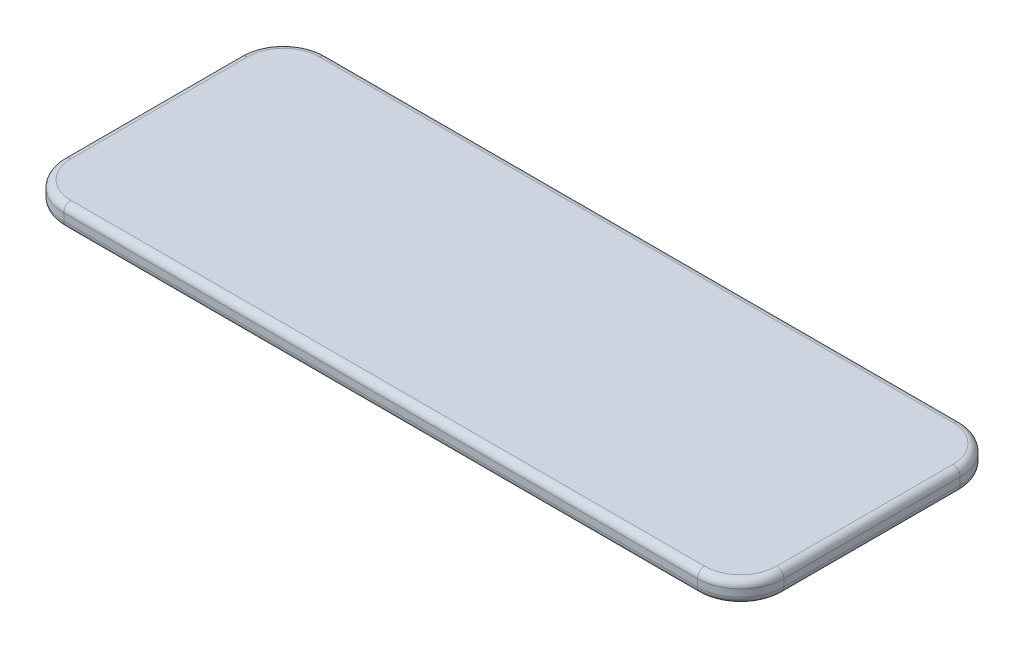
ISO-10303-21;
HEADER;
FILE_DESCRIPTION(('STEP AP214'),'2;1');
FILE_NAME('part.step','',(''),(''),'','','');
FILE_SCHEMA(('AUTOMOTIVE_DESIGN { 1 0 10303 214 1 1 1 1 }'));
ENDSEC;
DATA;
#1=APPLICATION_CONTEXT('core data for automotive mechanical design processes');
#2=APPLICATION_PROTOCOL_DEFINITION('international standard','automotive_design',2000,#1);
#3=PRODUCT_CONTEXT('',#1,'mechanical');
#4=PRODUCT('Part','Part','',(#3));
#5=PRODUCT_RELATED_PRODUCT_CATEGORY('part','',(#4));
#6=PRODUCT_DEFINITION_FORMATION('','',#4);
#7=PRODUCT_DEFINITION_CONTEXT('part definition',#1,'design');
#8=PRODUCT_DEFINITION('design','',#6,#7);
#9=PRODUCT_DEFINITION_SHAPE('','',#8);
#10=(LENGTH_UNIT() NAMED_UNIT(*) SI_UNIT(.MILLI.,.METRE.));
#11=(NAMED_UNIT(*) PLANE_ANGLE_UNIT() SI_UNIT($,.RADIAN.));
#12=(NAMED_UNIT(*) SI_UNIT($,.STERADIAN.) SOLID_ANGLE_UNIT());
#13=UNCERTAINTY_MEASURE_WITH_UNIT(LENGTH_MEASURE(1.E-05),#10,'distance_accuracy_value','');
#14=(GEOMETRIC_REPRESENTATION_CONTEXT(3) GLOBAL_UNCERTAINTY_ASSIGNED_CONTEXT((#13)) GLOBAL_UNIT_ASSIGNED_CONTEXT((#10,
#11,#12)) REPRESENTATION_CONTEXT('',''));
#15=CARTESIAN_POINT('',(0.,0.,0.));
#16=DIRECTION('',(0.,0.,1.));
#17=DIRECTION('',(1.,0.,0.));
#18=AXIS2_PLACEMENT_3D('',#15,#16,#17);
#19=CARTESIAN_POINT('',(-60.,30.,-305.));
#20=DIRECTION('',(0.,-1.,0.));
#21=DIRECTION('',(0.,0.,-1.));
#22=AXIS2_PLACEMENT_3D('',#19,#20,#21);
#23=CYLINDRICAL_SURFACE('',#22,60.);
#24=DIRECTION('',(0.,-1.,0.));
#25=VECTOR('',#24,1.);
#26=CARTESIAN_POINT('',(0.,30.,-305.));
#27=LINE('',#26,#25);
#28=CARTESIAN_POINT('',(0.,20.,-305.));
#29=VERTEX_POINT('',#28);
#30=CARTESIAN_POINT('',(0.,10.,-305.));
#31=VERTEX_POINT('',#30);
#32=EDGE_CURVE('E250',#29,#31,#27,.T.);
#33=ORIENTED_EDGE('',*,*,#32,.T.);
#34=CARTESIAN_POINT('',(-60.,10.,-305.));
#35=DIRECTION('',(0.,1.,0.));
#36=DIRECTION('',(0.,0.,1.));
#37=AXIS2_PLACEMENT_3D('',#34,#35,#36);
#38=CIRCLE('',#37,60.);
#39=CARTESIAN_POINT('',(-60.0000000000004,10.,-365.));
#40=VERTEX_POINT('',#39);
#41=EDGE_CURVE('E308',#31,#40,#38,.T.);
#42=ORIENTED_EDGE('',*,*,#41,.T.);
#43=DIRECTION('',(0.,-1.,0.));
#44=VECTOR('',#43,1.);
#45=CARTESIAN_POINT('',(-60.0000000000004,30.,-365.));
#46=LINE('',#45,#44);
#47=CARTESIAN_POINT('',(-60.0000000000004,20.,-365.));
#48=VERTEX_POINT('',#47);
#49=EDGE_CURVE('E184',#48,#40,#46,.T.);
#50=ORIENTED_EDGE('',*,*,#49,.F.);
#51=CARTESIAN_POINT('',(-60.,20.,-305.));
#52=DIRECTION('',(0.,1.,0.));
#53=DIRECTION('',(0.,0.,1.));
#54=AXIS2_PLACEMENT_3D('',#51,#52,#53);
#55=CIRCLE('',#54,60.);
#56=EDGE_CURVE('E311',#48,#29,#55,.F.);
#57=ORIENTED_EDGE('',*,*,#56,.T.);
#58=EDGE_LOOP('',(#33,#42,#50,#57));
#59=FACE_BOUND('',#58,.T.);
#60=ADVANCED_FACE('F41',(#59),#23,.T.);
#61=CARTESIAN_POINT('',(-60.0000000000004,30.,-365.));
#62=DIRECTION('',(0.,0.,1.));
#63=DIRECTION('',(1.,0.,0.));
#64=AXIS2_PLACEMENT_3D('',#61,#62,#63);
#65=PLANE('',#64);
#66=ORIENTED_EDGE('',*,*,#49,.T.);
#67=DIRECTION('',(-1.,0.,0.));
#68=VECTOR('',#67,1.);
#69=CARTESIAN_POINT('',(-60.0000000000004,10.,-365.));
#70=LINE('',#69,#68);
#71=CARTESIAN_POINT('',(-940.,10.,-365.));
#72=VERTEX_POINT('',#71);
#73=EDGE_CURVE('E314',#40,#72,#70,.T.);
#74=ORIENTED_EDGE('',*,*,#73,.T.);
#75=DIRECTION('',(0.,-1.,0.));
#76=VECTOR('',#75,1.);
#77=CARTESIAN_POINT('',(-940.,30.,-365.));
#78=LINE('',#77,#76);
#79=CARTESIAN_POINT('',(-940.,20.,-365.));
#80=VERTEX_POINT('',#79);
#81=EDGE_CURVE('E175',#80,#72,#78,.T.);
#82=ORIENTED_EDGE('',*,*,#81,.F.);
#83=DIRECTION('',(-1.,0.,0.));
#84=VECTOR('',#83,1.);
#85=CARTESIAN_POINT('',(-60.0000000000004,20.,-365.));
#86=LINE('',#85,#84);
#87=EDGE_CURVE('E317',#80,#48,#86,.F.);
#88=ORIENTED_EDGE('',*,*,#87,.T.);
#89=EDGE_LOOP('',(#66,#74,#82,#88));
#90=FACE_BOUND('',#89,.T.);
#91=ADVANCED_FACE('F389',(#90),#65,.F.);
#92=CARTESIAN_POINT('',(-940.,30.,-305.));
#93=DIRECTION('',(0.,-1.,0.));
#94=DIRECTION('',(0.,0.,-1.));
#95=AXIS2_PLACEMENT_3D('',#92,#93,#94);
#96=CYLINDRICAL_SURFACE('',#95,60.);
#97=ORIENTED_EDGE('',*,*,#81,.T.);
#98=CARTESIAN_POINT('',(-940.,10.,-305.));
#99=DIRECTION('',(0.,1.,0.));
#100=DIRECTION('',(0.,0.,1.));
#101=AXIS2_PLACEMENT_3D('',#98,#99,#100);
#102=CIRCLE('',#101,60.);
#103=CARTESIAN_POINT('',(-1000.,10.,-304.999999999999));
#104=VERTEX_POINT('',#103);
#105=EDGE_CURVE('E173',#72,#104,#102,.T.);
#106=ORIENTED_EDGE('',*,*,#105,.T.);
#107=DIRECTION('',(0.,-1.,0.));
#108=VECTOR('',#107,1.);
#109=CARTESIAN_POINT('',(-1000.,30.,-304.999999999999));
#110=LINE('',#109,#108);
#111=CARTESIAN_POINT('',(-1000.,20.,-304.999999999999));
#112=VERTEX_POINT('',#111);
#113=EDGE_CURVE('E159',#112,#104,#110,.T.);
#114=ORIENTED_EDGE('',*,*,#113,.F.);
#115=CARTESIAN_POINT('',(-940.,20.,-305.));
#116=DIRECTION('',(0.,1.,0.));
#117=DIRECTION('',(0.,0.,1.));
#118=AXIS2_PLACEMENT_3D('',#115,#116,#117);
#119=CIRCLE('',#118,60.);
#120=EDGE_CURVE('E170',#112,#80,#119,.F.);
#121=ORIENTED_EDGE('',*,*,#120,.T.);
#122=EDGE_LOOP('',(#97,#106,#114,#121));
#123=FACE_BOUND('',#122,.T.);
#124=ADVANCED_FACE('F169',(#123),#96,.T.);
#125=CARTESIAN_POINT('',(-1000.,30.,-60.0000000000004));
#126=DIRECTION('',(1.,0.,0.));
#127=DIRECTION('',(0.,0.,-1.));
#128=AXIS2_PLACEMENT_3D('',#125,#126,#127);
#129=PLANE('',#128);
#130=DIRECTION('',(0.,-1.,0.));
#131=VECTOR('',#130,1.);
#132=CARTESIAN_POINT('',(-1000.,30.,-60.0000000000004));
#133=LINE('',#132,#131);
#134=CARTESIAN_POINT('',(-1000.,20.,-60.0000000000004));
#135=VERTEX_POINT('',#134);
#136=CARTESIAN_POINT('',(-1000.,10.,-60.0000000000004));
#137=VERTEX_POINT('',#136);
#138=EDGE_CURVE('E161',#135,#137,#133,.T.);
#139=ORIENTED_EDGE('',*,*,#138,.F.);
#140=DIRECTION('',(0.,0.,1.));
#141=VECTOR('',#140,1.);
#142=CARTESIAN_POINT('',(-1000.,20.,-304.999999999999));
#143=LINE('',#142,#141);
#144=EDGE_CURVE('E11',#135,#112,#143,.F.);
#145=ORIENTED_EDGE('',*,*,#144,.T.);
#146=ORIENTED_EDGE('',*,*,#113,.T.);
#147=DIRECTION('',(0.,0.,1.));
#148=VECTOR('',#147,1.);
#149=CARTESIAN_POINT('',(-1000.,10.,-60.0000000000004));
#150=LINE('',#149,#148);
#151=EDGE_CURVE('E51',#104,#137,#150,.T.);
#152=ORIENTED_EDGE('',*,*,#151,.T.);
#153=EDGE_LOOP('',(#139,#145,#146,#152));
#154=FACE_BOUND('',#153,.T.);
#155=ADVANCED_FACE('F158',(#154),#129,.F.);
#156=CARTESIAN_POINT('',(-940.,30.,-60.));
#157=DIRECTION('',(0.,-1.,0.));
#158=DIRECTION('',(0.,0.,-1.));
#159=AXIS2_PLACEMENT_3D('',#156,#157,#158);
#160=CYLINDRICAL_SURFACE('',#159,60.);
#161=ORIENTED_EDGE('',*,*,#138,.T.);
#162=CARTESIAN_POINT('',(-940.,10.,-60.));
#163=DIRECTION('',(0.,1.,0.));
#164=DIRECTION('',(0.,0.,1.));
#165=AXIS2_PLACEMENT_3D('',#162,#163,#164);
#166=CIRCLE('',#165,60.);
#167=CARTESIAN_POINT('',(-940.,10.,0.));
#168=VERTEX_POINT('',#167);
#169=EDGE_CURVE('E285',#137,#168,#166,.T.);
#170=ORIENTED_EDGE('',*,*,#169,.T.);
#171=DIRECTION('',(0.,-1.,0.));
#172=VECTOR('',#171,1.);
#173=CARTESIAN_POINT('',(-940.,30.,0.));
#174=LINE('',#173,#172);
#175=CARTESIAN_POINT('',(-940.,20.,0.));
#176=VERTEX_POINT('',#175);
#177=EDGE_CURVE('E354',#176,#168,#174,.T.);
#178=ORIENTED_EDGE('',*,*,#177,.F.);
#179=CARTESIAN_POINT('',(-940.,20.,-60.));
#180=DIRECTION('',(0.,1.,0.));
#181=DIRECTION('',(0.,0.,1.));
#182=AXIS2_PLACEMENT_3D('',#179,#180,#181);
#183=CIRCLE('',#182,60.);
#184=EDGE_CURVE('E258',#176,#135,#183,.F.);
#185=ORIENTED_EDGE('',*,*,#184,.T.);
#186=EDGE_LOOP('',(#161,#170,#178,#185));
#187=FACE_BOUND('',#186,.T.);
#188=ADVANCED_FACE('F421',(#187),#160,.T.);
#189=CARTESIAN_POINT('',(-60.0000000000004,30.,0.));
#190=DIRECTION('',(0.,0.,-1.));
#191=DIRECTION('',(-1.,0.,0.));
#192=AXIS2_PLACEMENT_3D('',#189,#190,#191);
#193=PLANE('',#192);
#194=ORIENTED_EDGE('',*,*,#177,.T.);
#195=DIRECTION('',(1.,0.,0.));
#196=VECTOR('',#195,1.);
#197=CARTESIAN_POINT('',(-60.0000000000004,10.,0.));
#198=LINE('',#197,#196);
#199=CARTESIAN_POINT('',(-60.0000000000004,10.,0.));
#200=VERTEX_POINT('',#199);
#201=EDGE_CURVE('E290',#168,#200,#198,.T.);
#202=ORIENTED_EDGE('',*,*,#201,.T.);
#203=DIRECTION('',(0.,-1.,0.));
#204=VECTOR('',#203,1.);
#205=CARTESIAN_POINT('',(-60.0000000000004,30.,0.));
#206=LINE('',#205,#204);
#207=CARTESIAN_POINT('',(-60.0000000000004,20.,0.));
#208=VERTEX_POINT('',#207);
#209=EDGE_CURVE('E358',#208,#200,#206,.T.);
#210=ORIENTED_EDGE('',*,*,#209,.F.);
#211=DIRECTION('',(1.,0.,0.));
#212=VECTOR('',#211,1.);
#213=CARTESIAN_POINT('',(-940.,20.,0.));
#214=LINE('',#213,#212);
#215=EDGE_CURVE('E293',#208,#176,#214,.F.);
#216=ORIENTED_EDGE('',*,*,#215,.T.);
#217=EDGE_LOOP('',(#194,#202,#210,#216));
#218=FACE_BOUND('',#217,.T.);
#219=ADVANCED_FACE('F587',(#218),#193,.F.);
#220=CARTESIAN_POINT('',(-60.,30.,-60.));
#221=DIRECTION('',(0.,-1.,0.));
#222=DIRECTION('',(0.,0.,-1.));
#223=AXIS2_PLACEMENT_3D('',#220,#221,#222);
#224=CYLINDRICAL_SURFACE('',#223,60.);
#225=ORIENTED_EDGE('',*,*,#209,.T.);
#226=CARTESIAN_POINT('',(-60.,10.,-60.));
#227=DIRECTION('',(0.,1.,0.));
#228=DIRECTION('',(0.,0.,1.));
#229=AXIS2_PLACEMENT_3D('',#226,#227,#228);
#230=CIRCLE('',#229,60.);
#231=CARTESIAN_POINT('',(0.,10.,-60.0000000000004));
#232=VERTEX_POINT('',#231);
#233=EDGE_CURVE('E296',#200,#232,#230,.T.);
#234=ORIENTED_EDGE('',*,*,#233,.T.);
#235=DIRECTION('',(0.,-1.,0.));
#236=VECTOR('',#235,1.);
#237=CARTESIAN_POINT('',(0.,30.,-60.0000000000004));
#238=LINE('',#237,#236);
#239=CARTESIAN_POINT('',(0.,20.,-60.0000000000004));
#240=VERTEX_POINT('',#239);
#241=EDGE_CURVE('E362',#240,#232,#238,.T.);
#242=ORIENTED_EDGE('',*,*,#241,.F.);
#243=CARTESIAN_POINT('',(-60.,20.,-60.));
#244=DIRECTION('',(0.,1.,0.));
#245=DIRECTION('',(0.,0.,1.));
#246=AXIS2_PLACEMENT_3D('',#243,#244,#245);
#247=CIRCLE('',#246,60.);
#248=EDGE_CURVE('E299',#240,#208,#247,.F.);
#249=ORIENTED_EDGE('',*,*,#248,.T.);
#250=EDGE_LOOP('',(#225,#234,#242,#249));
#251=FACE_BOUND('',#250,.T.);
#252=ADVANCED_FACE('F399',(#251),#224,.T.);
#253=CARTESIAN_POINT('',(0.,30.,-60.0000000000004));
#254=DIRECTION('',(-1.,0.,0.));
#255=DIRECTION('',(0.,0.,1.));
#256=AXIS2_PLACEMENT_3D('',#253,#254,#255);
#257=PLANE('',#256);
#258=ORIENTED_EDGE('',*,*,#241,.T.);
#259=DIRECTION('',(0.,0.,-1.));
#260=VECTOR('',#259,1.);
#261=CARTESIAN_POINT('',(0.,10.,-60.0000000000004));
#262=LINE('',#261,#260);
#263=EDGE_CURVE('E302',#232,#31,#262,.T.);
#264=ORIENTED_EDGE('',*,*,#263,.T.);
#265=ORIENTED_EDGE('',*,*,#32,.F.);
#266=DIRECTION('',(0.,0.,-1.));
#267=VECTOR('',#266,1.);
#268=CARTESIAN_POINT('',(0.,20.,-60.0000000000004));
#269=LINE('',#268,#267);
#270=EDGE_CURVE('E305',#29,#240,#269,.F.);
#271=ORIENTED_EDGE('',*,*,#270,.T.);
#272=EDGE_LOOP('',(#258,#264,#265,#271));
#273=FACE_BOUND('',#272,.T.);
#274=ADVANCED_FACE('F396',(#273),#257,.F.);
#275=CARTESIAN_POINT('',(-60.,30.,-305.));
#276=DIRECTION('',(0.,1.,0.));
#277=DIRECTION('',(0.,0.,1.));
#278=AXIS2_PLACEMENT_3D('',#275,#276,#277);
#279=PLANE('',#278);
#280=DIRECTION('',(0.,0.,1.));
#281=VECTOR('',#280,1.);
#282=CARTESIAN_POINT('',(-990.,30.,-60.0000000000004));
#283=LINE('',#282,#281);
#284=CARTESIAN_POINT('',(-990.,30.,-304.999999999999));
#285=VERTEX_POINT('',#284);
#286=CARTESIAN_POINT('',(-990.,30.,-60.0000000000003));
#287=VERTEX_POINT('',#286);
#288=EDGE_CURVE('E59',#285,#287,#283,.T.);
#289=ORIENTED_EDGE('',*,*,#288,.T.);
#290=CARTESIAN_POINT('',(-940.,30.,-60.));
#291=DIRECTION('',(0.,1.,0.));
#292=DIRECTION('',(0.,0.,1.));
#293=AXIS2_PLACEMENT_3D('',#290,#291,#292);
#294=CIRCLE('',#293,50.);
#295=CARTESIAN_POINT('',(-940.,30.,-10.));
#296=VERTEX_POINT('',#295);
#297=EDGE_CURVE('E260',#287,#296,#294,.T.);
#298=ORIENTED_EDGE('',*,*,#297,.T.);
#299=DIRECTION('',(1.,0.,0.));
#300=VECTOR('',#299,1.);
#301=CARTESIAN_POINT('',(-60.0000000000004,30.,-10.));
#302=LINE('',#301,#300);
#303=CARTESIAN_POINT('',(-60.0000000000003,30.,-10.));
#304=VERTEX_POINT('',#303);
#305=EDGE_CURVE('E282',#296,#304,#302,.T.);
#306=ORIENTED_EDGE('',*,*,#305,.T.);
#307=CARTESIAN_POINT('',(-60.,30.,-60.));
#308=DIRECTION('',(0.,1.,0.));
#309=DIRECTION('',(0.,0.,1.));
#310=AXIS2_PLACEMENT_3D('',#307,#308,#309);
#311=CIRCLE('',#310,50.);
#312=CARTESIAN_POINT('',(-10.,30.,-60.0000000000004));
#313=VERTEX_POINT('',#312);
#314=EDGE_CURVE('E279',#304,#313,#311,.T.);
#315=ORIENTED_EDGE('',*,*,#314,.T.);
#316=DIRECTION('',(0.,0.,-1.));
#317=VECTOR('',#316,1.);
#318=CARTESIAN_POINT('',(-10.,30.,-305.));
#319=LINE('',#318,#317);
#320=CARTESIAN_POINT('',(-10.,30.,-305.));
#321=VERTEX_POINT('',#320);
#322=EDGE_CURVE('E276',#313,#321,#319,.T.);
#323=ORIENTED_EDGE('',*,*,#322,.T.);
#324=CARTESIAN_POINT('',(-60.,30.,-305.));
#325=DIRECTION('',(0.,1.,0.));
#326=DIRECTION('',(0.,0.,1.));
#327=AXIS2_PLACEMENT_3D('',#324,#325,#326);
#328=CIRCLE('',#327,50.);
#329=CARTESIAN_POINT('',(-60.0000000000004,30.,-355.));
#330=VERTEX_POINT('',#329);
#331=EDGE_CURVE('E273',#321,#330,#328,.T.);
#332=ORIENTED_EDGE('',*,*,#331,.T.);
#333=DIRECTION('',(-1.,0.,0.));
#334=VECTOR('',#333,1.);
#335=CARTESIAN_POINT('',(-940.,30.,-355.));
#336=LINE('',#335,#334);
#337=CARTESIAN_POINT('',(-940.,30.,-355.));
#338=VERTEX_POINT('',#337);
#339=EDGE_CURVE('E270',#330,#338,#336,.T.);
#340=ORIENTED_EDGE('',*,*,#339,.T.);
#341=CARTESIAN_POINT('',(-940.,30.,-305.));
#342=DIRECTION('',(0.,1.,0.));
#343=DIRECTION('',(0.,0.,1.));
#344=AXIS2_PLACEMENT_3D('',#341,#342,#343);
#345=CIRCLE('',#344,50.);
#346=EDGE_CURVE('E64',#338,#285,#345,.T.);
#347=ORIENTED_EDGE('',*,*,#346,.T.);
#348=EDGE_LOOP('',(#289,#298,#306,#315,#323,#332,#340,#347));
#349=FACE_BOUND('',#348,.T.);
#350=ADVANCED_FACE('F565',(#349),#279,.T.);
#351=CARTESIAN_POINT('',(-60.,0.,-305.));
#352=DIRECTION('',(0.,1.,0.));
#353=DIRECTION('',(0.,0.,1.));
#354=AXIS2_PLACEMENT_3D('',#351,#352,#353);
#355=PLANE('',#354);
#356=DIRECTION('',(0.,0.,1.));
#357=VECTOR('',#356,1.);
#358=CARTESIAN_POINT('',(-990.,0.,-305.));
#359=LINE('',#358,#357);
#360=CARTESIAN_POINT('',(-990.,0.,-60.0000000000003));
#361=VERTEX_POINT('',#360);
#362=CARTESIAN_POINT('',(-990.,0.,-304.999999999999));
#363=VERTEX_POINT('',#362);
#364=EDGE_CURVE('E342',#361,#363,#359,.F.);
#365=ORIENTED_EDGE('',*,*,#364,.T.);
#366=CARTESIAN_POINT('',(-940.,0.,-305.));
#367=DIRECTION('',(0.,1.,0.));
#368=DIRECTION('',(0.,0.,1.));
#369=AXIS2_PLACEMENT_3D('',#366,#367,#368);
#370=CIRCLE('',#369,50.);
#371=CARTESIAN_POINT('',(-940.,0.,-355.));
#372=VERTEX_POINT('',#371);
#373=EDGE_CURVE('E320',#363,#372,#370,.F.);
#374=ORIENTED_EDGE('',*,*,#373,.T.);
#375=DIRECTION('',(-1.,0.,0.));
#376=VECTOR('',#375,1.);
#377=CARTESIAN_POINT('',(-60.,0.,-355.));
#378=LINE('',#377,#376);
#379=CARTESIAN_POINT('',(-60.0000000000004,0.,-355.));
#380=VERTEX_POINT('',#379);
#381=EDGE_CURVE('E324',#372,#380,#378,.F.);
#382=ORIENTED_EDGE('',*,*,#381,.T.);
#383=CARTESIAN_POINT('',(-60.,0.,-305.));
#384=DIRECTION('',(0.,1.,0.));
#385=DIRECTION('',(0.,0.,1.));
#386=AXIS2_PLACEMENT_3D('',#383,#384,#385);
#387=CIRCLE('',#386,50.);
#388=CARTESIAN_POINT('',(-10.,0.,-305.));
#389=VERTEX_POINT('',#388);
#390=EDGE_CURVE('E327',#380,#389,#387,.F.);
#391=ORIENTED_EDGE('',*,*,#390,.T.);
#392=DIRECTION('',(0.,0.,-1.));
#393=VECTOR('',#392,1.);
#394=CARTESIAN_POINT('',(-10.,0.,-305.));
#395=LINE('',#394,#393);
#396=CARTESIAN_POINT('',(-10.,0.,-60.0000000000004));
#397=VERTEX_POINT('',#396);
#398=EDGE_CURVE('E330',#389,#397,#395,.F.);
#399=ORIENTED_EDGE('',*,*,#398,.T.);
#400=CARTESIAN_POINT('',(-60.,0.,-60.));
#401=DIRECTION('',(0.,1.,0.));
#402=DIRECTION('',(0.,0.,1.));
#403=AXIS2_PLACEMENT_3D('',#400,#401,#402);
#404=CIRCLE('',#403,50.);
#405=CARTESIAN_POINT('',(-60.0000000000003,0.,-10.));
#406=VERTEX_POINT('',#405);
#407=EDGE_CURVE('E333',#397,#406,#404,.F.);
#408=ORIENTED_EDGE('',*,*,#407,.T.);
#409=DIRECTION('',(1.,0.,0.));
#410=VECTOR('',#409,1.);
#411=CARTESIAN_POINT('',(-60.,0.,-10.));
#412=LINE('',#411,#410);
#413=CARTESIAN_POINT('',(-940.,0.,-9.99999999999997));
#414=VERTEX_POINT('',#413);
#415=EDGE_CURVE('E336',#406,#414,#412,.F.);
#416=ORIENTED_EDGE('',*,*,#415,.T.);
#417=CARTESIAN_POINT('',(-940.,0.,-60.));
#418=DIRECTION('',(0.,1.,0.));
#419=DIRECTION('',(0.,0.,1.));
#420=AXIS2_PLACEMENT_3D('',#417,#418,#419);
#421=CIRCLE('',#420,50.);
#422=EDGE_CURVE('E339',#414,#361,#421,.F.);
#423=ORIENTED_EDGE('',*,*,#422,.T.);
#424=EDGE_LOOP('',(#365,#374,#382,#391,#399,#408,#416,#423));
#425=FACE_BOUND('',#424,.T.);
#426=ADVANCED_FACE('F413',(#425),#355,.F.);
#427=CARTESIAN_POINT('',(-60.,10.,-60.));
#428=DIRECTION('',(0.,1.,0.));
#429=DIRECTION('',(0.,0.,1.));
#430=AXIS2_PLACEMENT_3D('',#427,#428,#429);
#431=TOROIDAL_SURFACE('',#430,50.,10.);
#432=CARTESIAN_POINT('',(-60.0000000000003,10.,-10.));
#433=DIRECTION('',(-1.,0.,0.));
#434=DIRECTION('',(0.,0.,1.));
#435=AXIS2_PLACEMENT_3D('',#432,#433,#434);
#436=CIRCLE('',#435,10.);
#437=EDGE_CURVE('E242',#406,#200,#436,.T.);
#438=ORIENTED_EDGE('',*,*,#437,.F.);
#439=ORIENTED_EDGE('',*,*,#407,.F.);
#440=CARTESIAN_POINT('',(-10.,10.,-60.0000000000003));
#441=DIRECTION('',(0.,0.,-1.));
#442=DIRECTION('',(-1.,0.,0.));
#443=AXIS2_PLACEMENT_3D('',#440,#441,#442);
#444=CIRCLE('',#443,10.);
#445=EDGE_CURVE('E246',#232,#397,#444,.T.);
#446=ORIENTED_EDGE('',*,*,#445,.F.);
#447=ORIENTED_EDGE('',*,*,#233,.F.);
#448=EDGE_LOOP('',(#438,#439,#446,#447));
#449=FACE_BOUND('',#448,.T.);
#450=ADVANCED_FACE('F404',(#449),#431,.T.);
#451=CARTESIAN_POINT('',(-10.,10.,-60.0000000000004));
#452=DIRECTION('',(0.,0.,-1.));
#453=DIRECTION('',(-1.,0.,0.));
#454=AXIS2_PLACEMENT_3D('',#451,#452,#453);
#455=CYLINDRICAL_SURFACE('',#454,10.);
#456=ORIENTED_EDGE('',*,*,#445,.T.);
#457=ORIENTED_EDGE('',*,*,#398,.F.);
#458=CARTESIAN_POINT('',(-10.,10.,-305.));
#459=DIRECTION('',(0.,0.,-1.));
#460=DIRECTION('',(0.,1.,0.));
#461=AXIS2_PLACEMENT_3D('',#458,#459,#460);
#462=CIRCLE('',#461,10.);
#463=EDGE_CURVE('E238',#31,#389,#462,.T.);
#464=ORIENTED_EDGE('',*,*,#463,.F.);
#465=ORIENTED_EDGE('',*,*,#263,.F.);
#466=EDGE_LOOP('',(#456,#457,#464,#465));
#467=FACE_BOUND('',#466,.T.);
#468=ADVANCED_FACE('F378',(#467),#455,.T.);
#469=CARTESIAN_POINT('',(-60.0000000000004,10.,-10.));
#470=DIRECTION('',(1.,0.,0.));
#471=DIRECTION('',(0.,0.,-1.));
#472=AXIS2_PLACEMENT_3D('',#469,#470,#471);
#473=CYLINDRICAL_SURFACE('',#472,10.);
#474=ORIENTED_EDGE('',*,*,#437,.T.);
#475=ORIENTED_EDGE('',*,*,#201,.F.);
#476=CARTESIAN_POINT('',(-940.,10.,-10.));
#477=DIRECTION('',(-1.,0.,0.));
#478=DIRECTION('',(0.,0.,1.));
#479=AXIS2_PLACEMENT_3D('',#476,#477,#478);
#480=CIRCLE('',#479,10.);
#481=EDGE_CURVE('E234',#414,#168,#480,.T.);
#482=ORIENTED_EDGE('',*,*,#481,.F.);
#483=ORIENTED_EDGE('',*,*,#415,.F.);
#484=EDGE_LOOP('',(#474,#475,#482,#483));
#485=FACE_BOUND('',#484,.T.);
#486=ADVANCED_FACE('F409',(#485),#473,.T.);
#487=CARTESIAN_POINT('',(-60.,10.,-305.));
#488=DIRECTION('',(0.,1.,0.));
#489=DIRECTION('',(0.,0.,1.));
#490=AXIS2_PLACEMENT_3D('',#487,#488,#489);
#491=TOROIDAL_SURFACE('',#490,50.,10.);
#492=ORIENTED_EDGE('',*,*,#463,.T.);
#493=ORIENTED_EDGE('',*,*,#390,.F.);
#494=CARTESIAN_POINT('',(-60.0000000000003,10.,-355.));
#495=DIRECTION('',(-1.,0.,0.));
#496=DIRECTION('',(0.,-1.,0.));
#497=AXIS2_PLACEMENT_3D('',#494,#495,#496);
#498=CIRCLE('',#497,10.);
#499=EDGE_CURVE('E230',#40,#380,#498,.T.);
#500=ORIENTED_EDGE('',*,*,#499,.F.);
#501=ORIENTED_EDGE('',*,*,#41,.F.);
#502=EDGE_LOOP('',(#492,#493,#500,#501));
#503=FACE_BOUND('',#502,.T.);
#504=ADVANCED_FACE('F382',(#503),#491,.T.);
#505=CARTESIAN_POINT('',(-940.,10.,-60.));
#506=DIRECTION('',(0.,1.,0.));
#507=DIRECTION('',(0.,0.,1.));
#508=AXIS2_PLACEMENT_3D('',#505,#506,#507);
#509=TOROIDAL_SURFACE('',#508,50.,10.);
#510=ORIENTED_EDGE('',*,*,#481,.T.);
#511=ORIENTED_EDGE('',*,*,#169,.F.);
#512=CARTESIAN_POINT('',(-990.,10.,-60.0000000000003));
#513=DIRECTION('',(0.,0.,-1.));
#514=DIRECTION('',(-1.,0.,0.));
#515=AXIS2_PLACEMENT_3D('',#512,#513,#514);
#516=CIRCLE('',#515,10.);
#517=EDGE_CURVE('E223',#361,#137,#516,.T.);
#518=ORIENTED_EDGE('',*,*,#517,.F.);
#519=ORIENTED_EDGE('',*,*,#422,.F.);
#520=EDGE_LOOP('',(#510,#511,#518,#519));
#521=FACE_BOUND('',#520,.T.);
#522=ADVANCED_FACE('F424',(#521),#509,.T.);
#523=CARTESIAN_POINT('',(-60.0000000000004,10.,-355.));
#524=DIRECTION('',(-1.,0.,0.));
#525=DIRECTION('',(0.,0.,1.));
#526=AXIS2_PLACEMENT_3D('',#523,#524,#525);
#527=CYLINDRICAL_SURFACE('',#526,10.);
#528=ORIENTED_EDGE('',*,*,#499,.T.);
#529=ORIENTED_EDGE('',*,*,#381,.F.);
#530=CARTESIAN_POINT('',(-940.,10.,-355.));
#531=DIRECTION('',(-1.,0.,0.));
#532=DIRECTION('',(0.,-1.,0.));
#533=AXIS2_PLACEMENT_3D('',#530,#531,#532);
#534=CIRCLE('',#533,10.);
#535=EDGE_CURVE('E216',#72,#372,#534,.T.);
#536=ORIENTED_EDGE('',*,*,#535,.F.);
#537=ORIENTED_EDGE('',*,*,#73,.F.);
#538=EDGE_LOOP('',(#528,#529,#536,#537));
#539=FACE_BOUND('',#538,.T.);
#540=ADVANCED_FACE('F387',(#539),#527,.T.);
#541=CARTESIAN_POINT('',(-990.,10.,-60.0000000000004));
#542=DIRECTION('',(0.,0.,1.));
#543=DIRECTION('',(1.,0.,0.));
#544=AXIS2_PLACEMENT_3D('',#541,#542,#543);
#545=CYLINDRICAL_SURFACE('',#544,10.);
#546=ORIENTED_EDGE('',*,*,#517,.T.);
#547=ORIENTED_EDGE('',*,*,#151,.F.);
#548=CARTESIAN_POINT('',(-990.,10.,-304.999999999999));
#549=DIRECTION('',(0.,0.,-1.));
#550=DIRECTION('',(-1.,0.,0.));
#551=AXIS2_PLACEMENT_3D('',#548,#549,#550);
#552=CIRCLE('',#551,10.);
#553=EDGE_CURVE('E210',#363,#104,#552,.T.);
#554=ORIENTED_EDGE('',*,*,#553,.F.);
#555=ORIENTED_EDGE('',*,*,#364,.F.);
#556=EDGE_LOOP('',(#546,#547,#554,#555));
#557=FACE_BOUND('',#556,.T.);
#558=ADVANCED_FACE('F418',(#557),#545,.T.);
#559=CARTESIAN_POINT('',(-940.,10.,-305.));
#560=DIRECTION('',(0.,1.,0.));
#561=DIRECTION('',(0.,0.,1.));
#562=AXIS2_PLACEMENT_3D('',#559,#560,#561);
#563=TOROIDAL_SURFACE('',#562,50.,10.);
#564=ORIENTED_EDGE('',*,*,#535,.T.);
#565=ORIENTED_EDGE('',*,*,#373,.F.);
#566=ORIENTED_EDGE('',*,*,#553,.T.);
#567=ORIENTED_EDGE('',*,*,#105,.F.);
#568=EDGE_LOOP('',(#564,#565,#566,#567));
#569=FACE_BOUND('',#568,.T.);
#570=ADVANCED_FACE('F416',(#569),#563,.T.);
#571=CARTESIAN_POINT('',(-60.,20.,-305.));
#572=DIRECTION('',(0.,1.,0.));
#573=DIRECTION('',(0.,0.,1.));
#574=AXIS2_PLACEMENT_3D('',#571,#572,#573);
#575=TOROIDAL_SURFACE('',#574,50.,10.);
#576=CARTESIAN_POINT('',(-9.99999999999999,20.,-305.));
#577=DIRECTION('',(0.,0.,1.));
#578=DIRECTION('',(1.,0.,0.));
#579=AXIS2_PLACEMENT_3D('',#576,#577,#578);
#580=CIRCLE('',#579,10.);
#581=EDGE_CURVE('E201',#29,#321,#580,.T.);
#582=ORIENTED_EDGE('',*,*,#581,.F.);
#583=ORIENTED_EDGE('',*,*,#56,.F.);
#584=CARTESIAN_POINT('',(-60.0000000000004,20.,-355.));
#585=DIRECTION('',(-1.,0.,0.));
#586=DIRECTION('',(0.,0.,1.));
#587=AXIS2_PLACEMENT_3D('',#584,#585,#586);
#588=CIRCLE('',#587,10.);
#589=EDGE_CURVE('E45',#330,#48,#588,.T.);
#590=ORIENTED_EDGE('',*,*,#589,.F.);
#591=ORIENTED_EDGE('',*,*,#331,.F.);
#592=EDGE_LOOP('',(#582,#583,#590,#591));
#593=FACE_BOUND('',#592,.T.);
#594=ADVANCED_FACE('F43',(#593),#575,.T.);
#595=CARTESIAN_POINT('',(-60.,20.,-355.));
#596=DIRECTION('',(1.,0.,0.));
#597=DIRECTION('',(0.,0.,-1.));
#598=AXIS2_PLACEMENT_3D('',#595,#596,#597);
#599=CYLINDRICAL_SURFACE('',#598,10.);
#600=ORIENTED_EDGE('',*,*,#589,.T.);
#601=ORIENTED_EDGE('',*,*,#87,.F.);
#602=CARTESIAN_POINT('',(-940.,20.,-355.));
#603=DIRECTION('',(-1.,0.,0.));
#604=DIRECTION('',(0.,0.,1.));
#605=AXIS2_PLACEMENT_3D('',#602,#603,#604);
#606=CIRCLE('',#605,10.);
#607=EDGE_CURVE('E182',#338,#80,#606,.T.);
#608=ORIENTED_EDGE('',*,*,#607,.F.);
#609=ORIENTED_EDGE('',*,*,#339,.F.);
#610=EDGE_LOOP('',(#600,#601,#608,#609));
#611=FACE_BOUND('',#610,.T.);
#612=ADVANCED_FACE('F458',(#611),#599,.T.);
#613=CARTESIAN_POINT('',(-10.,20.,-305.));
#614=DIRECTION('',(0.,0.,1.));
#615=DIRECTION('',(1.,0.,0.));
#616=AXIS2_PLACEMENT_3D('',#613,#614,#615);
#617=CYLINDRICAL_SURFACE('',#616,10.);
#618=ORIENTED_EDGE('',*,*,#581,.T.);
#619=ORIENTED_EDGE('',*,*,#322,.F.);
#620=CARTESIAN_POINT('',(-10.,20.,-60.0000000000004));
#621=DIRECTION('',(0.,0.,1.));
#622=DIRECTION('',(1.,0.,0.));
#623=AXIS2_PLACEMENT_3D('',#620,#621,#622);
#624=CIRCLE('',#623,10.);
#625=EDGE_CURVE('E188',#240,#313,#624,.T.);
#626=ORIENTED_EDGE('',*,*,#625,.F.);
#627=ORIENTED_EDGE('',*,*,#270,.F.);
#628=EDGE_LOOP('',(#618,#619,#626,#627));
#629=FACE_BOUND('',#628,.T.);
#630=ADVANCED_FACE('F393',(#629),#617,.T.);
#631=CARTESIAN_POINT('',(-940.,20.,-305.));
#632=DIRECTION('',(0.,1.,0.));
#633=DIRECTION('',(0.,0.,1.));
#634=AXIS2_PLACEMENT_3D('',#631,#632,#633);
#635=TOROIDAL_SURFACE('',#634,50.,10.);
#636=ORIENTED_EDGE('',*,*,#607,.T.);
#637=ORIENTED_EDGE('',*,*,#120,.F.);
#638=CARTESIAN_POINT('',(-990.,20.,-304.999999999999));
#639=DIRECTION('',(0.,0.,1.));
#640=DIRECTION('',(1.,0.,0.));
#641=AXIS2_PLACEMENT_3D('',#638,#639,#640);
#642=CIRCLE('',#641,10.);
#643=EDGE_CURVE('E180',#285,#112,#642,.T.);
#644=ORIENTED_EDGE('',*,*,#643,.F.);
#645=ORIENTED_EDGE('',*,*,#346,.F.);
#646=EDGE_LOOP('',(#636,#637,#644,#645));
#647=FACE_BOUND('',#646,.T.);
#648=ADVANCED_FACE('F179',(#647),#635,.T.);
#649=CARTESIAN_POINT('',(-60.,20.,-60.));
#650=DIRECTION('',(0.,1.,0.));
#651=DIRECTION('',(0.,0.,1.));
#652=AXIS2_PLACEMENT_3D('',#649,#650,#651);
#653=TOROIDAL_SURFACE('',#652,50.,10.);
#654=ORIENTED_EDGE('',*,*,#625,.T.);
#655=ORIENTED_EDGE('',*,*,#314,.F.);
#656=CARTESIAN_POINT('',(-60.0000000000003,20.,-10.));
#657=DIRECTION('',(-1.,0.,0.));
#658=DIRECTION('',(0.,0.,1.));
#659=AXIS2_PLACEMENT_3D('',#656,#657,#658);
#660=CIRCLE('',#659,10.);
#661=EDGE_CURVE('E189',#208,#304,#660,.T.);
#662=ORIENTED_EDGE('',*,*,#661,.F.);
#663=ORIENTED_EDGE('',*,*,#248,.F.);
#664=EDGE_LOOP('',(#654,#655,#662,#663));
#665=FACE_BOUND('',#664,.T.);
#666=ADVANCED_FACE('F475',(#665),#653,.T.);
#667=CARTESIAN_POINT('',(-990.,20.,-305.));
#668=DIRECTION('',(0.,0.,-1.));
#669=DIRECTION('',(-1.,0.,0.));
#670=AXIS2_PLACEMENT_3D('',#667,#668,#669);
#671=CYLINDRICAL_SURFACE('',#670,10.);
#672=ORIENTED_EDGE('',*,*,#643,.T.);
#673=ORIENTED_EDGE('',*,*,#144,.F.);
#674=CARTESIAN_POINT('',(-990.,20.,-60.0000000000003));
#675=DIRECTION('',(0.,0.,1.));
#676=DIRECTION('',(1.,0.,0.));
#677=AXIS2_PLACEMENT_3D('',#674,#675,#676);
#678=CIRCLE('',#677,10.);
#679=EDGE_CURVE('E196',#287,#135,#678,.T.);
#680=ORIENTED_EDGE('',*,*,#679,.F.);
#681=ORIENTED_EDGE('',*,*,#288,.F.);
#682=EDGE_LOOP('',(#672,#673,#680,#681));
#683=FACE_BOUND('',#682,.T.);
#684=ADVANCED_FACE('F186',(#683),#671,.T.);
#685=CARTESIAN_POINT('',(-60.,20.,-10.));
#686=DIRECTION('',(-1.,0.,0.));
#687=DIRECTION('',(0.,0.,1.));
#688=AXIS2_PLACEMENT_3D('',#685,#686,#687);
#689=CYLINDRICAL_SURFACE('',#688,10.);
#690=ORIENTED_EDGE('',*,*,#661,.T.);
#691=ORIENTED_EDGE('',*,*,#305,.F.);
#692=CARTESIAN_POINT('',(-940.,20.,-10.));
#693=DIRECTION('',(-1.,0.,0.));
#694=DIRECTION('',(0.,-1.,0.));
#695=AXIS2_PLACEMENT_3D('',#692,#693,#694);
#696=CIRCLE('',#695,10.);
#697=EDGE_CURVE('E251',#176,#296,#696,.T.);
#698=ORIENTED_EDGE('',*,*,#697,.F.);
#699=ORIENTED_EDGE('',*,*,#215,.F.);
#700=EDGE_LOOP('',(#690,#691,#698,#699));
#701=FACE_BOUND('',#700,.T.);
#702=ADVANCED_FACE('F489',(#701),#689,.T.);
#703=CARTESIAN_POINT('',(-940.,20.,-60.));
#704=DIRECTION('',(0.,1.,0.));
#705=DIRECTION('',(0.,0.,1.));
#706=AXIS2_PLACEMENT_3D('',#703,#704,#705);
#707=TOROIDAL_SURFACE('',#706,50.,10.);
#708=ORIENTED_EDGE('',*,*,#679,.T.);
#709=ORIENTED_EDGE('',*,*,#184,.F.);
#710=ORIENTED_EDGE('',*,*,#697,.T.);
#711=ORIENTED_EDGE('',*,*,#297,.F.);
#712=EDGE_LOOP('',(#708,#709,#710,#711));
#713=FACE_BOUND('',#712,.T.);
#714=ADVANCED_FACE('F257',(#713),#707,.T.);
#715=CLOSED_SHELL('',(#60,#91,#124,#155,#188,#219,#252,#274,#350,#426,#450,#468,#486,#504,#522,
#540,#558,#570,#594,#612,#630,#648,#666,#684,#702,#714));
#716=MANIFOLD_SOLID_BREP('B2',#715);
#717=ADVANCED_BREP_SHAPE_REPRESENTATION('',(#18,#716),#14);
#718=SHAPE_DEFINITION_REPRESENTATION(#9,#717);
ENDSEC;
END-ISO-10303-21;
